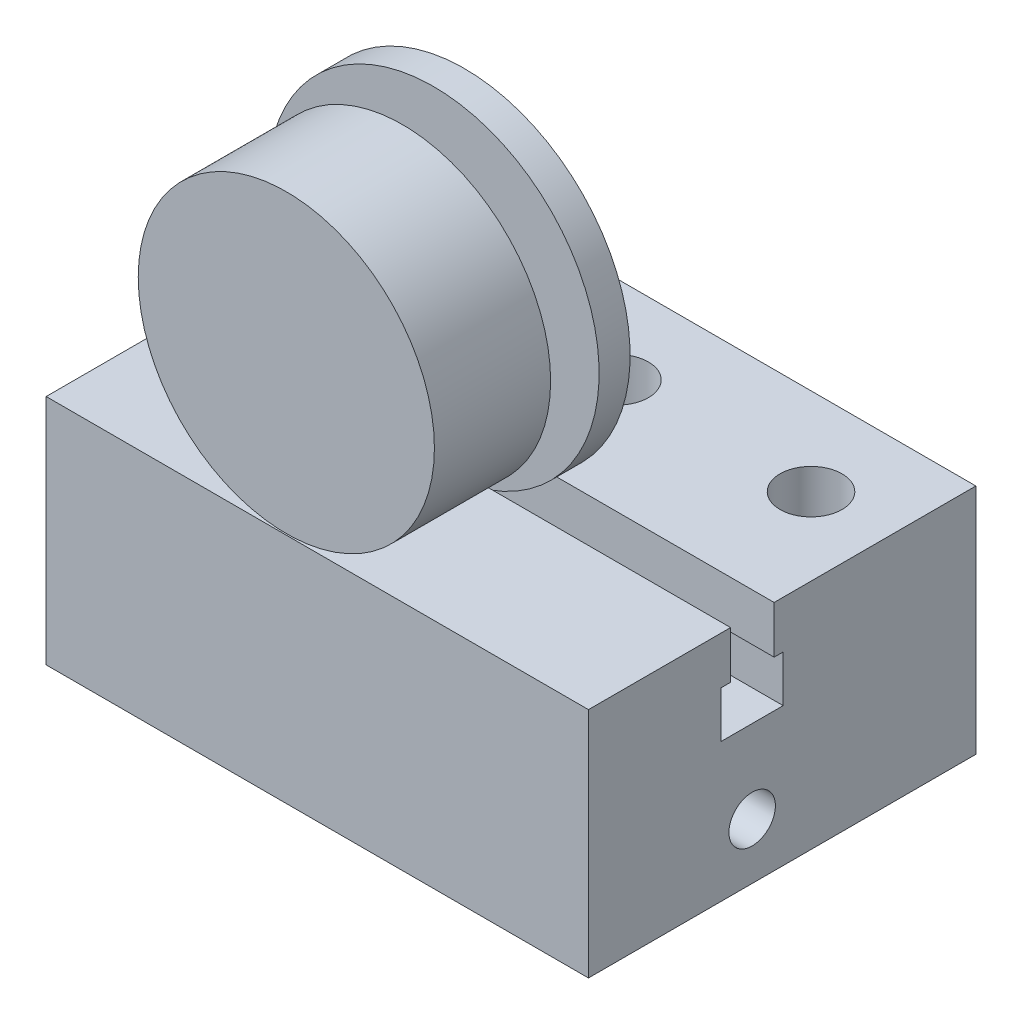
ISO-10303-21;
HEADER;
FILE_DESCRIPTION(('STEP AP214'),'2;1');
FILE_NAME('part.step','',(''),(''),'','','');
FILE_SCHEMA(('AUTOMOTIVE_DESIGN { 1 0 10303 214 1 1 1 1 }'));
ENDSEC;
DATA;
#1=APPLICATION_CONTEXT('core data for automotive mechanical design processes');
#2=APPLICATION_PROTOCOL_DEFINITION('international standard','automotive_design',2000,#1);
#3=PRODUCT_CONTEXT('',#1,'mechanical');
#4=PRODUCT('Part','Part','',(#3));
#5=PRODUCT_RELATED_PRODUCT_CATEGORY('part','',(#4));
#6=PRODUCT_DEFINITION_FORMATION('','',#4);
#7=PRODUCT_DEFINITION_CONTEXT('part definition',#1,'design');
#8=PRODUCT_DEFINITION('design','',#6,#7);
#9=PRODUCT_DEFINITION_SHAPE('','',#8);
#10=(LENGTH_UNIT() NAMED_UNIT(*) SI_UNIT(.MILLI.,.METRE.));
#11=(NAMED_UNIT(*) PLANE_ANGLE_UNIT() SI_UNIT($,.RADIAN.));
#12=(NAMED_UNIT(*) SI_UNIT($,.STERADIAN.) SOLID_ANGLE_UNIT());
#13=UNCERTAINTY_MEASURE_WITH_UNIT(LENGTH_MEASURE(1.E-05),#10,'distance_accuracy_value','');
#14=(GEOMETRIC_REPRESENTATION_CONTEXT(3) GLOBAL_UNCERTAINTY_ASSIGNED_CONTEXT((#13)) GLOBAL_UNIT_ASSIGNED_CONTEXT((#10,
#11,#12)) REPRESENTATION_CONTEXT('',''));
#15=CARTESIAN_POINT('',(0.,0.,0.));
#16=DIRECTION('',(0.,0.,1.));
#17=DIRECTION('',(1.,0.,0.));
#18=AXIS2_PLACEMENT_3D('',#15,#16,#17);
#19=CARTESIAN_POINT('',(41.2550470304355,49.28493929241,-9.74186060689164));
#20=DIRECTION('',(0.,0.,1.));
#21=DIRECTION('',(1.,0.,0.));
#22=AXIS2_PLACEMENT_3D('',#19,#20,#21);
#23=CYLINDRICAL_SURFACE('',#22,19.1151149246732);
#24=CARTESIAN_POINT('',(41.2550470304355,49.28493929241,-9.74186060689164));
#25=DIRECTION('',(0.,0.,1.));
#26=DIRECTION('',(1.,0.,0.));
#27=AXIS2_PLACEMENT_3D('',#24,#25,#26);
#28=CIRCLE('',#27,19.1151149246732);
#29=CARTESIAN_POINT('',(60.3701619551087,49.28493929241,-9.74186060689164));
#30=VERTEX_POINT('',#29);
#31=EDGE_CURVE('E47',#30,#30,#28,.T.);
#32=ORIENTED_EDGE('',*,*,#31,.T.);
#33=EDGE_LOOP('',(#32));
#34=FACE_BOUND('',#33,.T.);
#35=CARTESIAN_POINT('',(41.2550470304355,49.28493929241,5.25813939310836));
#36=DIRECTION('',(0.,0.,1.));
#37=DIRECTION('',(1.,0.,0.));
#38=AXIS2_PLACEMENT_3D('',#35,#36,#37);
#39=CIRCLE('',#38,19.1151149246732);
#40=CARTESIAN_POINT('',(60.3701619551087,49.28493929241,5.25813939310836));
#41=VERTEX_POINT('',#40);
#42=EDGE_CURVE('E51',#41,#41,#39,.T.);
#43=ORIENTED_EDGE('',*,*,#42,.F.);
#44=EDGE_LOOP('',(#43));
#45=FACE_BOUND('',#44,.T.);
#46=ADVANCED_FACE('F41',(#34,#45),#23,.T.);
#47=CARTESIAN_POINT('',(41.2550470304355,49.28493929241,-9.74186060689164));
#48=DIRECTION('',(0.,0.,1.));
#49=DIRECTION('',(1.,0.,0.));
#50=AXIS2_PLACEMENT_3D('',#47,#48,#49);
#51=PLANE('',#50);
#52=CARTESIAN_POINT('',(41.2550470304355,49.28493929241,-9.74186060689164));
#53=DIRECTION('',(0.,0.,1.));
#54=DIRECTION('',(1.,0.,0.));
#55=AXIS2_PLACEMENT_3D('',#52,#53,#54);
#56=CIRCLE('',#55,2.);
#57=CARTESIAN_POINT('',(43.2550470304355,49.28493929241,-9.74186060689164));
#58=VERTEX_POINT('',#57);
#59=EDGE_CURVE('E11',#58,#58,#56,.F.);
#60=ORIENTED_EDGE('',*,*,#59,.F.);
#61=EDGE_LOOP('',(#60));
#62=FACE_BOUND('',#61,.T.);
#63=ORIENTED_EDGE('',*,*,#31,.F.);
#64=EDGE_LOOP('',(#63));
#65=FACE_BOUND('',#64,.T.);
#66=ADVANCED_FACE('F85',(#62,#65),#51,.F.);
#67=CARTESIAN_POINT('',(41.2550470304355,49.28493929241,5.25813939310836));
#68=DIRECTION('',(0.,0.,1.));
#69=DIRECTION('',(1.,0.,0.));
#70=AXIS2_PLACEMENT_3D('',#67,#68,#69);
#71=PLANE('',#70);
#72=ORIENTED_EDGE('',*,*,#42,.T.);
#73=EDGE_LOOP('',(#72));
#74=FACE_BOUND('',#73,.T.);
#75=ADVANCED_FACE('F89',(#74),#71,.T.);
#76=CARTESIAN_POINT('',(41.2550470304355,49.28493929241,-13.7418606068916));
#77=DIRECTION('',(0.,0.,1.));
#78=DIRECTION('',(1.,0.,0.));
#79=AXIS2_PLACEMENT_3D('',#76,#77,#78);
#80=CYLINDRICAL_SURFACE('',#79,2.);
#81=CARTESIAN_POINT('',(41.2550470304355,49.28493929241,-13.7418606068916));
#82=DIRECTION('',(0.,0.,-1.));
#83=DIRECTION('',(-1.,0.,0.));
#84=AXIS2_PLACEMENT_3D('',#81,#82,#83);
#85=CIRCLE('',#84,2.);
#86=CARTESIAN_POINT('',(39.2550470304355,49.28493929241,-13.7418606068916));
#87=VERTEX_POINT('',#86);
#88=EDGE_CURVE('E56',#87,#87,#85,.T.);
#89=ORIENTED_EDGE('',*,*,#88,.F.);
#90=EDGE_LOOP('',(#89));
#91=FACE_BOUND('',#90,.T.);
#92=ORIENTED_EDGE('',*,*,#59,.T.);
#93=EDGE_LOOP('',(#92));
#94=FACE_BOUND('',#93,.T.);
#95=ADVANCED_FACE('F72',(#91,#94),#80,.T.);
#96=CARTESIAN_POINT('',(41.2550470304355,49.28493929241,-17.7418606068917));
#97=DIRECTION('',(0.,0.,1.));
#98=DIRECTION('',(1.,0.,0.));
#99=AXIS2_PLACEMENT_3D('',#96,#97,#98);
#100=CYLINDRICAL_SURFACE('',#99,21.3745458164872);
#101=CARTESIAN_POINT('',(41.2550470304355,49.28493929241,-17.7418606068917));
#102=DIRECTION('',(0.,0.,-1.));
#103=DIRECTION('',(-1.,0.,0.));
#104=AXIS2_PLACEMENT_3D('',#101,#102,#103);
#105=CIRCLE('',#104,21.3745458164872);
#106=CARTESIAN_POINT('',(19.8805012139483,49.28493929241,-17.7418606068917));
#107=VERTEX_POINT('',#106);
#108=EDGE_CURVE('E60',#107,#107,#105,.T.);
#109=ORIENTED_EDGE('',*,*,#108,.F.);
#110=EDGE_LOOP('',(#109));
#111=FACE_BOUND('',#110,.T.);
#112=CARTESIAN_POINT('',(41.2550470304355,49.28493929241,-13.7418606068916));
#113=DIRECTION('',(0.,0.,-1.));
#114=DIRECTION('',(-1.,0.,0.));
#115=AXIS2_PLACEMENT_3D('',#112,#113,#114);
#116=CIRCLE('',#115,21.3745458164872);
#117=CARTESIAN_POINT('',(19.8805012139483,49.28493929241,-13.7418606068916));
#118=VERTEX_POINT('',#117);
#119=EDGE_CURVE('E61',#118,#118,#116,.T.);
#120=ORIENTED_EDGE('',*,*,#119,.T.);
#121=EDGE_LOOP('',(#120));
#122=FACE_BOUND('',#121,.T.);
#123=ADVANCED_FACE('F69',(#111,#122),#100,.T.);
#124=CARTESIAN_POINT('',(41.2550470304355,49.28493929241,-17.7418606068917));
#125=DIRECTION('',(0.,0.,-1.));
#126=DIRECTION('',(-1.,0.,0.));
#127=AXIS2_PLACEMENT_3D('',#124,#125,#126);
#128=PLANE('',#127);
#129=ORIENTED_EDGE('',*,*,#108,.T.);
#130=EDGE_LOOP('',(#129));
#131=FACE_BOUND('',#130,.T.);
#132=ADVANCED_FACE('F67',(#131),#128,.T.);
#133=CARTESIAN_POINT('',(41.2550470304355,49.28493929241,-13.7418606068916));
#134=DIRECTION('',(0.,0.,-1.));
#135=DIRECTION('',(-1.,0.,0.));
#136=AXIS2_PLACEMENT_3D('',#133,#134,#135);
#137=PLANE('',#136);
#138=ORIENTED_EDGE('',*,*,#88,.T.);
#139=EDGE_LOOP('',(#138));
#140=FACE_BOUND('',#139,.T.);
#141=ORIENTED_EDGE('',*,*,#119,.F.);
#142=EDGE_LOOP('',(#141));
#143=FACE_BOUND('',#142,.T.);
#144=ADVANCED_FACE('F76',(#140,#143),#137,.F.);
#145=CLOSED_SHELL('',(#46,#66,#75,#95,#123,#132,#144));
#146=MANIFOLD_SOLID_BREP('B2',#145);
#147=CARTESIAN_POINT('',(0.,30.,0.));
#148=DIRECTION('',(0.,1.,0.));
#149=DIRECTION('',(0.,0.,1.));
#150=AXIS2_PLACEMENT_3D('',#147,#148,#149);
#151=PLANE('',#150);
#152=DIRECTION('',(-1.,0.,0.));
#153=VECTOR('',#152,1.);
#154=CARTESIAN_POINT('',(81.2550470304356,30.,-13.0866570962311));
#155=LINE('',#154,#153);
#156=CARTESIAN_POINT('',(80.2550470304355,30.,-13.0866570962311));
#157=VERTEX_POINT('',#156);
#158=CARTESIAN_POINT('',(10.2550470304355,30.,-13.0866570962311));
#159=VERTEX_POINT('',#158);
#160=EDGE_CURVE('E324',#157,#159,#155,.T.);
#161=ORIENTED_EDGE('',*,*,#160,.T.);
#162=DIRECTION('',(0.,0.,1.));
#163=VECTOR('',#162,1.);
#164=CARTESIAN_POINT('',(10.2550470304355,30.,-44.7418606068916));
#165=LINE('',#164,#163);
#166=CARTESIAN_POINT('',(10.2550470304355,30.,5.25813939310836));
#167=VERTEX_POINT('',#166);
#168=EDGE_CURVE('E196',#159,#167,#165,.T.);
#169=ORIENTED_EDGE('',*,*,#168,.T.);
#170=DIRECTION('',(1.,0.,0.));
#171=VECTOR('',#170,1.);
#172=CARTESIAN_POINT('',(10.2550470304355,30.,5.25813939310836));
#173=LINE('',#172,#171);
#174=CARTESIAN_POINT('',(80.2550470304355,30.,5.25813939310836));
#175=VERTEX_POINT('',#174);
#176=EDGE_CURVE('E260',#167,#175,#173,.T.);
#177=ORIENTED_EDGE('',*,*,#176,.T.);
#178=DIRECTION('',(0.,0.,-1.));
#179=VECTOR('',#178,1.);
#180=CARTESIAN_POINT('',(80.2550470304355,30.,-44.7418606068916));
#181=LINE('',#180,#179);
#182=EDGE_CURVE('E268',#175,#157,#181,.T.);
#183=ORIENTED_EDGE('',*,*,#182,.T.);
#184=EDGE_LOOP('',(#161,#169,#177,#183));
#185=FACE_BOUND('',#184,.T.);
#186=ADVANCED_FACE('F142',(#185),#151,.T.);
#187=DIRECTION('',(-1.,0.,0.));
#188=VECTOR('',#187,1.);
#189=CARTESIAN_POINT('',(81.2550470304356,30.,-18.703311226993));
#190=LINE('',#189,#188);
#191=CARTESIAN_POINT('',(80.2550470304355,30.,-18.703311226993));
#192=VERTEX_POINT('',#191);
#193=CARTESIAN_POINT('',(10.2550470304355,30.,-18.703311226993));
#194=VERTEX_POINT('',#193);
#195=EDGE_CURVE('E241',#192,#194,#190,.T.);
#196=ORIENTED_EDGE('',*,*,#195,.F.);
#197=CARTESIAN_POINT('',(80.2550470304355,30.,-44.7418606068916));
#198=VERTEX_POINT('',#197);
#199=EDGE_CURVE('E262',#192,#198,#181,.T.);
#200=ORIENTED_EDGE('',*,*,#199,.T.);
#201=DIRECTION('',(-1.,0.,0.));
#202=VECTOR('',#201,1.);
#203=CARTESIAN_POINT('',(10.2550470304355,30.,-44.7418606068916));
#204=LINE('',#203,#202);
#205=CARTESIAN_POINT('',(10.2550470304355,30.,-44.7418606068916));
#206=VERTEX_POINT('',#205);
#207=EDGE_CURVE('E167',#198,#206,#204,.T.);
#208=ORIENTED_EDGE('',*,*,#207,.T.);
#209=EDGE_CURVE('E253',#206,#194,#165,.T.);
#210=ORIENTED_EDGE('',*,*,#209,.T.);
#211=EDGE_LOOP('',(#196,#200,#208,#210));
#212=FACE_BOUND('',#211,.T.);
#213=CARTESIAN_POINT('',(70.255045380468,30.,-33.4667699089909));
#214=DIRECTION('',(0.,1.,0.));
#215=DIRECTION('',(0.,0.,1.));
#216=AXIS2_PLACEMENT_3D('',#213,#214,#215);
#217=CIRCLE('',#216,4.00000000000001);
#218=CARTESIAN_POINT('',(70.255045380468,30.,-29.4667699089909));
#219=VERTEX_POINT('',#218);
#220=EDGE_CURVE('E341',#219,#219,#217,.T.);
#221=ORIENTED_EDGE('',*,*,#220,.F.);
#222=EDGE_LOOP('',(#221));
#223=FACE_BOUND('',#222,.T.);
#224=CARTESIAN_POINT('',(45.2550470304355,30.,-33.4758527704242));
#225=DIRECTION('',(0.,1.,0.));
#226=DIRECTION('',(0.,0.,1.));
#227=AXIS2_PLACEMENT_3D('',#224,#225,#226);
#228=CIRCLE('',#227,4.);
#229=CARTESIAN_POINT('',(45.2550470304355,30.,-29.4758527704242));
#230=VERTEX_POINT('',#229);
#231=EDGE_CURVE('E277',#230,#230,#228,.T.);
#232=ORIENTED_EDGE('',*,*,#231,.F.);
#233=EDGE_LOOP('',(#232));
#234=FACE_BOUND('',#233,.T.);
#235=CARTESIAN_POINT('',(20.2550483188397,30.,-33.4678265506144));
#236=DIRECTION('',(0.,1.,0.));
#237=DIRECTION('',(0.,0.,1.));
#238=AXIS2_PLACEMENT_3D('',#235,#236,#237);
#239=CIRCLE('',#238,4.00000000000001);
#240=CARTESIAN_POINT('',(20.2550483188397,30.,-29.4678265506144));
#241=VERTEX_POINT('',#240);
#242=EDGE_CURVE('E334',#241,#241,#239,.T.);
#243=ORIENTED_EDGE('',*,*,#242,.F.);
#244=EDGE_LOOP('',(#243));
#245=FACE_BOUND('',#244,.T.);
#246=ADVANCED_FACE('F258',(#212,#223,#234,#245),#151,.T.);
#247=CARTESIAN_POINT('',(0.,0.,0.));
#248=DIRECTION('',(0.,1.,0.));
#249=DIRECTION('',(0.,0.,1.));
#250=AXIS2_PLACEMENT_3D('',#247,#248,#249);
#251=PLANE('',#250);
#252=DIRECTION('',(0.,0.,1.));
#253=VECTOR('',#252,1.);
#254=CARTESIAN_POINT('',(10.2550470304355,0.,-44.7418606068916));
#255=LINE('',#254,#253);
#256=CARTESIAN_POINT('',(10.2550470304355,0.,-44.7418606068916));
#257=VERTEX_POINT('',#256);
#258=CARTESIAN_POINT('',(10.2550470304355,0.,5.25813939310836));
#259=VERTEX_POINT('',#258);
#260=EDGE_CURVE('E273',#257,#259,#255,.T.);
#261=ORIENTED_EDGE('',*,*,#260,.F.);
#262=DIRECTION('',(-1.,0.,0.));
#263=VECTOR('',#262,1.);
#264=CARTESIAN_POINT('',(10.2550470304355,0.,-44.7418606068916));
#265=LINE('',#264,#263);
#266=CARTESIAN_POINT('',(80.2550470304355,0.,-44.7418606068916));
#267=VERTEX_POINT('',#266);
#268=EDGE_CURVE('E188',#267,#257,#265,.T.);
#269=ORIENTED_EDGE('',*,*,#268,.F.);
#270=DIRECTION('',(0.,0.,-1.));
#271=VECTOR('',#270,1.);
#272=CARTESIAN_POINT('',(80.2550470304355,0.,-44.7418606068916));
#273=LINE('',#272,#271);
#274=CARTESIAN_POINT('',(80.2550470304355,0.,5.25813939310836));
#275=VERTEX_POINT('',#274);
#276=EDGE_CURVE('E279',#275,#267,#273,.T.);
#277=ORIENTED_EDGE('',*,*,#276,.F.);
#278=DIRECTION('',(1.,0.,0.));
#279=VECTOR('',#278,1.);
#280=CARTESIAN_POINT('',(10.2550470304355,0.,5.25813939310836));
#281=LINE('',#280,#279);
#282=EDGE_CURVE('E276',#259,#275,#281,.T.);
#283=ORIENTED_EDGE('',*,*,#282,.F.);
#284=EDGE_LOOP('',(#261,#269,#277,#283));
#285=FACE_BOUND('',#284,.T.);
#286=CARTESIAN_POINT('',(45.2550470304355,0.,-33.4758527704242));
#287=DIRECTION('',(0.,1.,0.));
#288=DIRECTION('',(0.,0.,1.));
#289=AXIS2_PLACEMENT_3D('',#286,#287,#288);
#290=CIRCLE('',#289,4.);
#291=CARTESIAN_POINT('',(45.2550470304355,0.,-29.4758527704242));
#292=VERTEX_POINT('',#291);
#293=EDGE_CURVE('E265',#292,#292,#290,.T.);
#294=ORIENTED_EDGE('',*,*,#293,.T.);
#295=EDGE_LOOP('',(#294));
#296=FACE_BOUND('',#295,.T.);
#297=CARTESIAN_POINT('',(70.255045380468,0.,-33.4667699089909));
#298=DIRECTION('',(0.,1.,0.));
#299=DIRECTION('',(0.,0.,1.));
#300=AXIS2_PLACEMENT_3D('',#297,#298,#299);
#301=CIRCLE('',#300,4.00000000000001);
#302=CARTESIAN_POINT('',(70.255045380468,0.,-29.4667699089909));
#303=VERTEX_POINT('',#302);
#304=EDGE_CURVE('E337',#303,#303,#301,.T.);
#305=ORIENTED_EDGE('',*,*,#304,.T.);
#306=EDGE_LOOP('',(#305));
#307=FACE_BOUND('',#306,.T.);
#308=CARTESIAN_POINT('',(20.2550483188397,0.,-33.4678265506144));
#309=DIRECTION('',(0.,1.,0.));
#310=DIRECTION('',(0.,0.,1.));
#311=AXIS2_PLACEMENT_3D('',#308,#309,#310);
#312=CIRCLE('',#311,4.00000000000001);
#313=CARTESIAN_POINT('',(20.2550483188397,0.,-29.4678265506144));
#314=VERTEX_POINT('',#313);
#315=EDGE_CURVE('E338',#314,#314,#312,.T.);
#316=ORIENTED_EDGE('',*,*,#315,.T.);
#317=EDGE_LOOP('',(#316));
#318=FACE_BOUND('',#317,.T.);
#319=ADVANCED_FACE('F351',(#285,#296,#307,#318),#251,.F.);
#320=CARTESIAN_POINT('',(10.2550470304355,30.,-44.7418606068916));
#321=DIRECTION('',(1.,0.,0.));
#322=DIRECTION('',(0.,0.,-1.));
#323=AXIS2_PLACEMENT_3D('',#320,#321,#322);
#324=PLANE('',#323);
#325=CARTESIAN_POINT('',(10.2550470304355,7.19869921568161,-15.8705885299082));
#326=DIRECTION('',(-1.,0.,0.));
#327=DIRECTION('',(0.,0.,1.));
#328=AXIS2_PLACEMENT_3D('',#325,#326,#327);
#329=CIRCLE('',#328,3.);
#330=CARTESIAN_POINT('',(10.2550470304355,7.19869921568161,-12.8705885299082));
#331=VERTEX_POINT('',#330);
#332=EDGE_CURVE('E410',#331,#331,#329,.T.);
#333=ORIENTED_EDGE('',*,*,#332,.F.);
#334=EDGE_LOOP('',(#333));
#335=FACE_BOUND('',#334,.T.);
#336=ORIENTED_EDGE('',*,*,#168,.F.);
#337=DIRECTION('',(0.,1.,0.));
#338=VECTOR('',#337,1.);
#339=CARTESIAN_POINT('',(10.2550470304355,30.,-13.0866570962311));
#340=LINE('',#339,#338);
#341=CARTESIAN_POINT('',(10.2550470304355,23.8810272551289,-13.0866570962311));
#342=VERTEX_POINT('',#341);
#343=EDGE_CURVE('E249',#342,#159,#340,.T.);
#344=ORIENTED_EDGE('',*,*,#343,.F.);
#345=DIRECTION('',(0.,0.,-1.));
#346=VECTOR('',#345,1.);
#347=CARTESIAN_POINT('',(10.2550470304355,23.8810272551289,-13.0866570962311));
#348=LINE('',#347,#346);
#349=CARTESIAN_POINT('',(10.2550470304355,23.8810272551289,-11.8705885299082));
#350=VERTEX_POINT('',#349);
#351=EDGE_CURVE('E405',#350,#342,#348,.T.);
#352=ORIENTED_EDGE('',*,*,#351,.F.);
#353=DIRECTION('',(0.,1.,0.));
#354=VECTOR('',#353,1.);
#355=CARTESIAN_POINT('',(10.2550470304355,23.8810272551289,-11.8705885299082));
#356=LINE('',#355,#354);
#357=CARTESIAN_POINT('',(10.2550470304355,17.8810272551289,-11.8705885299082));
#358=VERTEX_POINT('',#357);
#359=EDGE_CURVE('E320',#358,#350,#356,.T.);
#360=ORIENTED_EDGE('',*,*,#359,.F.);
#361=DIRECTION('',(0.,0.,1.));
#362=VECTOR('',#361,1.);
#363=CARTESIAN_POINT('',(10.2550470304355,17.8810272551289,-19.8705885299082));
#364=LINE('',#363,#362);
#365=CARTESIAN_POINT('',(10.2550470304355,17.8810272551289,-19.8705885299082));
#366=VERTEX_POINT('',#365);
#367=EDGE_CURVE('E402',#366,#358,#364,.T.);
#368=ORIENTED_EDGE('',*,*,#367,.F.);
#369=DIRECTION('',(0.,-1.,0.));
#370=VECTOR('',#369,1.);
#371=CARTESIAN_POINT('',(10.2550470304355,17.8810272551289,-19.8705885299082));
#372=LINE('',#371,#370);
#373=CARTESIAN_POINT('',(10.2550470304355,23.8810272551289,-19.8705885299082));
#374=VERTEX_POINT('',#373);
#375=EDGE_CURVE('E397',#374,#366,#372,.T.);
#376=ORIENTED_EDGE('',*,*,#375,.F.);
#377=DIRECTION('',(0.,0.,-1.));
#378=VECTOR('',#377,1.);
#379=CARTESIAN_POINT('',(10.2550470304355,23.8810272551289,-19.8705885299082));
#380=LINE('',#379,#378);
#381=CARTESIAN_POINT('',(10.2550470304355,23.8810272551289,-18.703311226993));
#382=VERTEX_POINT('',#381);
#383=EDGE_CURVE('E256',#382,#374,#380,.T.);
#384=ORIENTED_EDGE('',*,*,#383,.F.);
#385=DIRECTION('',(0.,-1.,0.));
#386=VECTOR('',#385,1.);
#387=CARTESIAN_POINT('',(10.2550470304355,23.8810272551289,-18.703311226993));
#388=LINE('',#387,#386);
#389=EDGE_CURVE('E244',#194,#382,#388,.T.);
#390=ORIENTED_EDGE('',*,*,#389,.F.);
#391=ORIENTED_EDGE('',*,*,#209,.F.);
#392=DIRECTION('',(0.,-1.,0.));
#393=VECTOR('',#392,1.);
#394=CARTESIAN_POINT('',(10.2550470304355,30.,-44.7418606068916));
#395=LINE('',#394,#393);
#396=EDGE_CURVE('E272',#206,#257,#395,.T.);
#397=ORIENTED_EDGE('',*,*,#396,.T.);
#398=ORIENTED_EDGE('',*,*,#260,.T.);
#399=DIRECTION('',(0.,-1.,0.));
#400=VECTOR('',#399,1.);
#401=CARTESIAN_POINT('',(10.2550470304355,30.,5.25813939310836));
#402=LINE('',#401,#400);
#403=EDGE_CURVE('E288',#167,#259,#402,.T.);
#404=ORIENTED_EDGE('',*,*,#403,.F.);
#405=EDGE_LOOP('',(#336,#344,#352,#360,#368,#376,#384,#390,#391,#397,#398,#404));
#406=FACE_BOUND('',#405,.T.);
#407=ADVANCED_FACE('F144',(#335,#406),#324,.F.);
#408=CARTESIAN_POINT('',(10.2550470304355,30.,5.25813939310836));
#409=DIRECTION('',(0.,0.,-1.));
#410=DIRECTION('',(-1.,0.,0.));
#411=AXIS2_PLACEMENT_3D('',#408,#409,#410);
#412=PLANE('',#411);
#413=ORIENTED_EDGE('',*,*,#282,.T.);
#414=DIRECTION('',(0.,-1.,0.));
#415=VECTOR('',#414,1.);
#416=CARTESIAN_POINT('',(80.2550470304355,30.,5.25813939310836));
#417=LINE('',#416,#415);
#418=EDGE_CURVE('E285',#175,#275,#417,.T.);
#419=ORIENTED_EDGE('',*,*,#418,.F.);
#420=ORIENTED_EDGE('',*,*,#176,.F.);
#421=ORIENTED_EDGE('',*,*,#403,.T.);
#422=EDGE_LOOP('',(#413,#419,#420,#421));
#423=FACE_BOUND('',#422,.T.);
#424=ADVANCED_FACE('F377',(#423),#412,.F.);
#425=CARTESIAN_POINT('',(80.2550470304355,30.,-44.7418606068916));
#426=DIRECTION('',(-1.,0.,0.));
#427=DIRECTION('',(0.,0.,1.));
#428=AXIS2_PLACEMENT_3D('',#425,#426,#427);
#429=PLANE('',#428);
#430=CARTESIAN_POINT('',(80.2550470304355,7.19869921568161,-15.8705885299082));
#431=DIRECTION('',(-1.,0.,0.));
#432=DIRECTION('',(0.,0.,1.));
#433=AXIS2_PLACEMENT_3D('',#430,#431,#432);
#434=CIRCLE('',#433,3.);
#435=CARTESIAN_POINT('',(80.2550470304355,7.19869921568161,-12.8705885299082));
#436=VERTEX_POINT('',#435);
#437=EDGE_CURVE('E146',#436,#436,#434,.T.);
#438=ORIENTED_EDGE('',*,*,#437,.T.);
#439=EDGE_LOOP('',(#438));
#440=FACE_BOUND('',#439,.T.);
#441=DIRECTION('',(0.,0.,-1.));
#442=VECTOR('',#441,1.);
#443=CARTESIAN_POINT('',(80.2550470304355,23.8810272551289,-44.7418606068916));
#444=LINE('',#443,#442);
#445=CARTESIAN_POINT('',(80.2550470304355,23.8810272551289,-11.8705885299082));
#446=VERTEX_POINT('',#445);
#447=CARTESIAN_POINT('',(80.2550470304355,23.8810272551289,-13.0866570962311));
#448=VERTEX_POINT('',#447);
#449=EDGE_CURVE('E151',#446,#448,#444,.T.);
#450=ORIENTED_EDGE('',*,*,#449,.T.);
#451=DIRECTION('',(0.,1.,0.));
#452=VECTOR('',#451,1.);
#453=CARTESIAN_POINT('',(80.2550470304355,30.,-13.0866570962311));
#454=LINE('',#453,#452);
#455=EDGE_CURVE('E39',#448,#157,#454,.T.);
#456=ORIENTED_EDGE('',*,*,#455,.T.);
#457=ORIENTED_EDGE('',*,*,#182,.F.);
#458=ORIENTED_EDGE('',*,*,#418,.T.);
#459=ORIENTED_EDGE('',*,*,#276,.T.);
#460=DIRECTION('',(0.,-1.,0.));
#461=VECTOR('',#460,1.);
#462=CARTESIAN_POINT('',(80.2550470304355,30.,-44.7418606068916));
#463=LINE('',#462,#461);
#464=EDGE_CURVE('E283',#198,#267,#463,.T.);
#465=ORIENTED_EDGE('',*,*,#464,.F.);
#466=ORIENTED_EDGE('',*,*,#199,.F.);
#467=DIRECTION('',(0.,-1.,0.));
#468=VECTOR('',#467,1.);
#469=CARTESIAN_POINT('',(80.2550470304355,30.,-18.703311226993));
#470=LINE('',#469,#468);
#471=CARTESIAN_POINT('',(80.2550470304355,23.8810272551289,-18.703311226993));
#472=VERTEX_POINT('',#471);
#473=EDGE_CURVE('E247',#192,#472,#470,.T.);
#474=ORIENTED_EDGE('',*,*,#473,.T.);
#475=DIRECTION('',(0.,0.,-1.));
#476=VECTOR('',#475,1.);
#477=CARTESIAN_POINT('',(80.2550470304355,23.8810272551289,-44.7418606068916));
#478=LINE('',#477,#476);
#479=CARTESIAN_POINT('',(80.2550470304355,23.8810272551289,-19.8705885299082));
#480=VERTEX_POINT('',#479);
#481=EDGE_CURVE('E292',#472,#480,#478,.T.);
#482=ORIENTED_EDGE('',*,*,#481,.T.);
#483=DIRECTION('',(0.,-1.,0.));
#484=VECTOR('',#483,1.);
#485=CARTESIAN_POINT('',(80.2550470304355,30.,-19.8705885299082));
#486=LINE('',#485,#484);
#487=CARTESIAN_POINT('',(80.2550470304355,17.8810272551289,-19.8705885299082));
#488=VERTEX_POINT('',#487);
#489=EDGE_CURVE('E295',#480,#488,#486,.T.);
#490=ORIENTED_EDGE('',*,*,#489,.T.);
#491=DIRECTION('',(0.,0.,1.));
#492=VECTOR('',#491,1.);
#493=CARTESIAN_POINT('',(80.2550470304355,17.8810272551289,-44.7418606068916));
#494=LINE('',#493,#492);
#495=CARTESIAN_POINT('',(80.2550470304355,17.8810272551289,-11.8705885299082));
#496=VERTEX_POINT('',#495);
#497=EDGE_CURVE('E298',#488,#496,#494,.T.);
#498=ORIENTED_EDGE('',*,*,#497,.T.);
#499=DIRECTION('',(0.,1.,0.));
#500=VECTOR('',#499,1.);
#501=CARTESIAN_POINT('',(80.2550470304355,30.,-11.8705885299082));
#502=LINE('',#501,#500);
#503=EDGE_CURVE('E301',#496,#446,#502,.T.);
#504=ORIENTED_EDGE('',*,*,#503,.T.);
#505=EDGE_LOOP('',(#450,#456,#457,#458,#459,#465,#466,#474,#482,#490,#498,#504));
#506=FACE_BOUND('',#505,.T.);
#507=ADVANCED_FACE('F306',(#440,#506),#429,.F.);
#508=CARTESIAN_POINT('',(10.2550470304355,30.,-44.7418606068916));
#509=DIRECTION('',(0.,0.,1.));
#510=DIRECTION('',(1.,0.,0.));
#511=AXIS2_PLACEMENT_3D('',#508,#509,#510);
#512=PLANE('',#511);
#513=ORIENTED_EDGE('',*,*,#268,.T.);
#514=ORIENTED_EDGE('',*,*,#396,.F.);
#515=ORIENTED_EDGE('',*,*,#207,.F.);
#516=ORIENTED_EDGE('',*,*,#464,.T.);
#517=EDGE_LOOP('',(#513,#514,#515,#516));
#518=FACE_BOUND('',#517,.T.);
#519=ADVANCED_FACE('F357',(#518),#512,.F.);
#520=CARTESIAN_POINT('',(45.2550470304355,30.,-33.4758527704242));
#521=DIRECTION('',(0.,-1.,0.));
#522=DIRECTION('',(0.,0.,-1.));
#523=AXIS2_PLACEMENT_3D('',#520,#521,#522);
#524=CYLINDRICAL_SURFACE('',#523,4.);
#525=ORIENTED_EDGE('',*,*,#231,.T.);
#526=EDGE_LOOP('',(#525));
#527=FACE_BOUND('',#526,.T.);
#528=ORIENTED_EDGE('',*,*,#293,.F.);
#529=EDGE_LOOP('',(#528));
#530=FACE_BOUND('',#529,.T.);
#531=ADVANCED_FACE('F354',(#527,#530),#524,.F.);
#532=CARTESIAN_POINT('',(70.255045380468,30.,-33.4667699089909));
#533=DIRECTION('',(0.,-1.,0.));
#534=DIRECTION('',(0.,0.,-1.));
#535=AXIS2_PLACEMENT_3D('',#532,#533,#534);
#536=CYLINDRICAL_SURFACE('',#535,4.00000000000001);
#537=ORIENTED_EDGE('',*,*,#220,.T.);
#538=EDGE_LOOP('',(#537));
#539=FACE_BOUND('',#538,.T.);
#540=ORIENTED_EDGE('',*,*,#304,.F.);
#541=EDGE_LOOP('',(#540));
#542=FACE_BOUND('',#541,.T.);
#543=ADVANCED_FACE('F356',(#539,#542),#536,.F.);
#544=CARTESIAN_POINT('',(20.2550483188397,30.,-33.4678265506144));
#545=DIRECTION('',(0.,-1.,0.));
#546=DIRECTION('',(0.,0.,-1.));
#547=AXIS2_PLACEMENT_3D('',#544,#545,#546);
#548=CYLINDRICAL_SURFACE('',#547,4.00000000000001);
#549=ORIENTED_EDGE('',*,*,#242,.T.);
#550=EDGE_LOOP('',(#549));
#551=FACE_BOUND('',#550,.T.);
#552=ORIENTED_EDGE('',*,*,#315,.F.);
#553=EDGE_LOOP('',(#552));
#554=FACE_BOUND('',#553,.T.);
#555=ADVANCED_FACE('F363',(#551,#554),#548,.F.);
#556=CARTESIAN_POINT('',(81.2550470304356,30.,-13.0866570962311));
#557=DIRECTION('',(0.,0.,1.));
#558=DIRECTION('',(1.,0.,0.));
#559=AXIS2_PLACEMENT_3D('',#556,#557,#558);
#560=PLANE('',#559);
#561=DIRECTION('',(-1.,0.,0.));
#562=VECTOR('',#561,1.);
#563=CARTESIAN_POINT('',(81.2550470304356,23.8810272551289,-13.0866570962311));
#564=LINE('',#563,#562);
#565=EDGE_CURVE('E315',#448,#342,#564,.T.);
#566=ORIENTED_EDGE('',*,*,#565,.T.);
#567=ORIENTED_EDGE('',*,*,#343,.T.);
#568=ORIENTED_EDGE('',*,*,#160,.F.);
#569=ORIENTED_EDGE('',*,*,#455,.F.);
#570=EDGE_LOOP('',(#566,#567,#568,#569));
#571=FACE_BOUND('',#570,.T.);
#572=ADVANCED_FACE('F427',(#571),#560,.F.);
#573=CARTESIAN_POINT('',(81.2550470304356,23.8810272551289,-13.0866570962311));
#574=DIRECTION('',(0.,1.,0.));
#575=DIRECTION('',(0.,0.,1.));
#576=AXIS2_PLACEMENT_3D('',#573,#574,#575);
#577=PLANE('',#576);
#578=DIRECTION('',(-1.,0.,0.));
#579=VECTOR('',#578,1.);
#580=CARTESIAN_POINT('',(81.2550470304356,23.8810272551289,-11.8705885299082));
#581=LINE('',#580,#579);
#582=EDGE_CURVE('E313',#446,#350,#581,.T.);
#583=ORIENTED_EDGE('',*,*,#582,.T.);
#584=ORIENTED_EDGE('',*,*,#351,.T.);
#585=ORIENTED_EDGE('',*,*,#565,.F.);
#586=ORIENTED_EDGE('',*,*,#449,.F.);
#587=EDGE_LOOP('',(#583,#584,#585,#586));
#588=FACE_BOUND('',#587,.T.);
#589=ADVANCED_FACE('F311',(#588),#577,.F.);
#590=CARTESIAN_POINT('',(81.2550470304356,23.8810272551289,-11.8705885299082));
#591=DIRECTION('',(0.,0.,1.));
#592=DIRECTION('',(0.,-1.,0.));
#593=AXIS2_PLACEMENT_3D('',#590,#591,#592);
#594=PLANE('',#593);
#595=DIRECTION('',(-1.,0.,0.));
#596=VECTOR('',#595,1.);
#597=CARTESIAN_POINT('',(81.2550470304356,17.8810272551289,-11.8705885299082));
#598=LINE('',#597,#596);
#599=EDGE_CURVE('E322',#496,#358,#598,.T.);
#600=ORIENTED_EDGE('',*,*,#599,.T.);
#601=ORIENTED_EDGE('',*,*,#359,.T.);
#602=ORIENTED_EDGE('',*,*,#582,.F.);
#603=ORIENTED_EDGE('',*,*,#503,.F.);
#604=EDGE_LOOP('',(#600,#601,#602,#603));
#605=FACE_BOUND('',#604,.T.);
#606=ADVANCED_FACE('F317',(#605),#594,.F.);
#607=CARTESIAN_POINT('',(81.2550470304356,17.8810272551289,-19.8705885299082));
#608=DIRECTION('',(0.,-1.,0.));
#609=DIRECTION('',(0.,0.,-1.));
#610=AXIS2_PLACEMENT_3D('',#607,#608,#609);
#611=PLANE('',#610);
#612=DIRECTION('',(-1.,0.,0.));
#613=VECTOR('',#612,1.);
#614=CARTESIAN_POINT('',(81.2550470304356,17.8810272551289,-19.8705885299082));
#615=LINE('',#614,#613);
#616=EDGE_CURVE('E326',#488,#366,#615,.T.);
#617=ORIENTED_EDGE('',*,*,#616,.T.);
#618=ORIENTED_EDGE('',*,*,#367,.T.);
#619=ORIENTED_EDGE('',*,*,#599,.F.);
#620=ORIENTED_EDGE('',*,*,#497,.F.);
#621=EDGE_LOOP('',(#617,#618,#619,#620));
#622=FACE_BOUND('',#621,.T.);
#623=ADVANCED_FACE('F401',(#622),#611,.F.);
#624=CARTESIAN_POINT('',(81.2550470304356,17.8810272551289,-19.8705885299082));
#625=DIRECTION('',(0.,0.,-1.));
#626=DIRECTION('',(-1.,0.,0.));
#627=AXIS2_PLACEMENT_3D('',#624,#625,#626);
#628=PLANE('',#627);
#629=DIRECTION('',(-1.,0.,0.));
#630=VECTOR('',#629,1.);
#631=CARTESIAN_POINT('',(81.2550470304356,23.8810272551289,-19.8705885299082));
#632=LINE('',#631,#630);
#633=EDGE_CURVE('E331',#480,#374,#632,.T.);
#634=ORIENTED_EDGE('',*,*,#633,.T.);
#635=ORIENTED_EDGE('',*,*,#375,.T.);
#636=ORIENTED_EDGE('',*,*,#616,.F.);
#637=ORIENTED_EDGE('',*,*,#489,.F.);
#638=EDGE_LOOP('',(#634,#635,#636,#637));
#639=FACE_BOUND('',#638,.T.);
#640=ADVANCED_FACE('F395',(#639),#628,.F.);
#641=CARTESIAN_POINT('',(81.2550470304356,23.8810272551289,-19.8705885299082));
#642=DIRECTION('',(0.,1.,0.));
#643=DIRECTION('',(0.,0.,1.));
#644=AXIS2_PLACEMENT_3D('',#641,#642,#643);
#645=PLANE('',#644);
#646=DIRECTION('',(-1.,0.,0.));
#647=VECTOR('',#646,1.);
#648=CARTESIAN_POINT('',(81.2550470304356,23.8810272551289,-18.703311226993));
#649=LINE('',#648,#647);
#650=EDGE_CURVE('E158',#472,#382,#649,.T.);
#651=ORIENTED_EDGE('',*,*,#650,.T.);
#652=ORIENTED_EDGE('',*,*,#383,.T.);
#653=ORIENTED_EDGE('',*,*,#633,.F.);
#654=ORIENTED_EDGE('',*,*,#481,.F.);
#655=EDGE_LOOP('',(#651,#652,#653,#654));
#656=FACE_BOUND('',#655,.T.);
#657=ADVANCED_FACE('F392',(#656),#645,.F.);
#658=CARTESIAN_POINT('',(81.2550470304356,23.8810272551289,-18.703311226993));
#659=DIRECTION('',(0.,0.,-1.));
#660=DIRECTION('',(-1.,0.,0.));
#661=AXIS2_PLACEMENT_3D('',#658,#659,#660);
#662=PLANE('',#661);
#663=ORIENTED_EDGE('',*,*,#195,.T.);
#664=ORIENTED_EDGE('',*,*,#389,.T.);
#665=ORIENTED_EDGE('',*,*,#650,.F.);
#666=ORIENTED_EDGE('',*,*,#473,.F.);
#667=EDGE_LOOP('',(#663,#664,#665,#666));
#668=FACE_BOUND('',#667,.T.);
#669=ADVANCED_FACE('F243',(#668),#662,.F.);
#670=CARTESIAN_POINT('',(81.2550470304356,7.19869921568161,-15.8705885299082));
#671=DIRECTION('',(-1.,0.,0.));
#672=DIRECTION('',(0.,0.,1.));
#673=AXIS2_PLACEMENT_3D('',#670,#671,#672);
#674=CYLINDRICAL_SURFACE('',#673,3.);
#675=ORIENTED_EDGE('',*,*,#332,.T.);
#676=EDGE_LOOP('',(#675));
#677=FACE_BOUND('',#676,.T.);
#678=ORIENTED_EDGE('',*,*,#437,.F.);
#679=EDGE_LOOP('',(#678));
#680=FACE_BOUND('',#679,.T.);
#681=ADVANCED_FACE('F419',(#677,#680),#674,.F.);
#682=CLOSED_SHELL('',(#186,#246,#319,#407,#424,#507,#519,#531,#543,#555,#572,#589,#606,#623,
#640,#657,#669,#681));
#683=MANIFOLD_SOLID_BREP('B6',#682);
#684=ADVANCED_BREP_SHAPE_REPRESENTATION('',(#18,#146,#683),#14);
#685=SHAPE_DEFINITION_REPRESENTATION(#9,#684);
ENDSEC;
END-ISO-10303-21;
